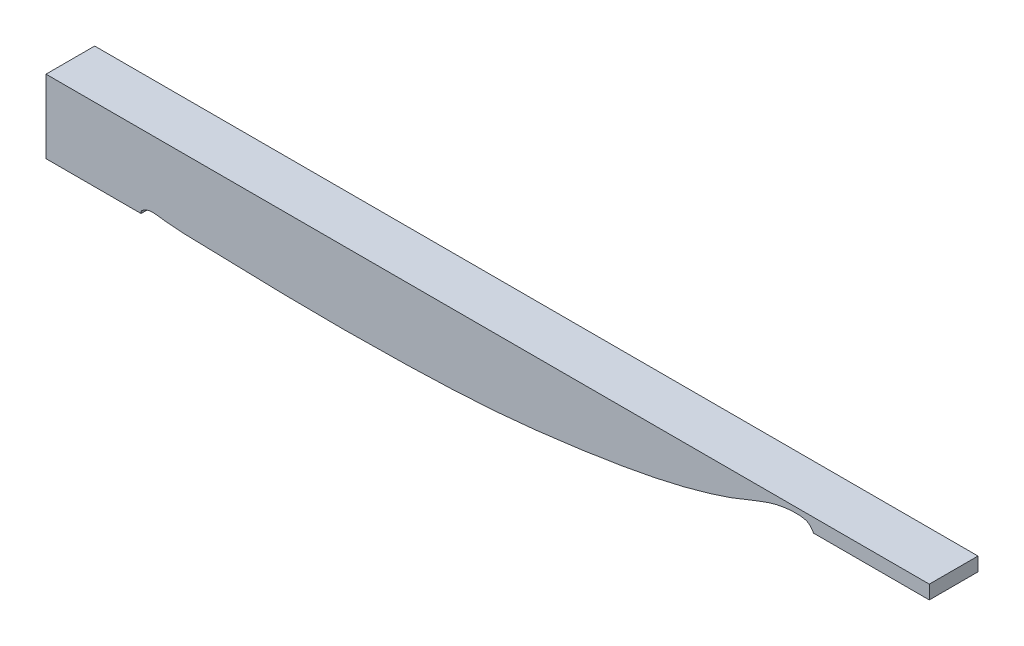
ISO-10303-21;
HEADER;
FILE_DESCRIPTION(('STEP AP214'),'2;1');
FILE_NAME('part.step','',(''),(''),'','','');
FILE_SCHEMA(('AUTOMOTIVE_DESIGN { 1 0 10303 214 1 1 1 1 }'));
ENDSEC;
DATA;
#1=APPLICATION_CONTEXT('core data for automotive mechanical design processes');
#2=APPLICATION_PROTOCOL_DEFINITION('international standard','automotive_design',2000,#1);
#3=PRODUCT_CONTEXT('',#1,'mechanical');
#4=PRODUCT('Part','Part','',(#3));
#5=PRODUCT_RELATED_PRODUCT_CATEGORY('part','',(#4));
#6=PRODUCT_DEFINITION_FORMATION('','',#4);
#7=PRODUCT_DEFINITION_CONTEXT('part definition',#1,'design');
#8=PRODUCT_DEFINITION('design','',#6,#7);
#9=PRODUCT_DEFINITION_SHAPE('','',#8);
#10=(LENGTH_UNIT() NAMED_UNIT(*) SI_UNIT(.MILLI.,.METRE.));
#11=(NAMED_UNIT(*) PLANE_ANGLE_UNIT() SI_UNIT($,.RADIAN.));
#12=(NAMED_UNIT(*) SI_UNIT($,.STERADIAN.) SOLID_ANGLE_UNIT());
#13=UNCERTAINTY_MEASURE_WITH_UNIT(LENGTH_MEASURE(1.E-05),#10,'distance_accuracy_value','');
#14=(GEOMETRIC_REPRESENTATION_CONTEXT(3) GLOBAL_UNCERTAINTY_ASSIGNED_CONTEXT((#13)) GLOBAL_UNIT_ASSIGNED_CONTEXT((#10,
#11,#12)) REPRESENTATION_CONTEXT('',''));
#15=CARTESIAN_POINT('',(0.,0.,0.));
#16=DIRECTION('',(0.,0.,1.));
#17=DIRECTION('',(1.,0.,0.));
#18=AXIS2_PLACEMENT_3D('',#15,#16,#17);
#19=CARTESIAN_POINT('',(-66.3110095027111,-9.77705874573914,468.));
#20=CARTESIAN_POINT('',(-66.316235060897,-9.70373392122121,468.));
#21=CARTESIAN_POINT('',(-66.320590620901,-9.63037802621979,468.));
#22=CARTESIAN_POINT('',(-66.2994351576771,-9.48259960274422,468.));
#23=CARTESIAN_POINT('',(-66.2737412349066,-9.41110036570704,468.));
#24=CARTESIAN_POINT('',(-66.1938541980312,-9.28648881474915,468.));
#25=CARTESIAN_POINT('',(-66.137546237911,-9.23559779741836,468.));
#26=CARTESIAN_POINT('',(-66.015569610567,-9.15124688152581,468.));
#27=CARTESIAN_POINT('',(-65.9515979105995,-9.11329273950191,468.));
#28=CARTESIAN_POINT('',(-65.7616357941962,-8.99725054402569,468.));
#29=CARTESIAN_POINT('',(-65.6322068467814,-8.9255063295734,468.));
#30=CARTESIAN_POINT('',(-65.36364446324,-8.80157370983703,468.));
#31=CARTESIAN_POINT('',(-65.2218015380496,-8.75117333694517,468.));
#32=CARTESIAN_POINT('',(-64.7920811657736,-8.65055987463684,468.));
#33=CARTESIAN_POINT('',(-64.498748426524,-8.64014984402587,468.));
#34=CARTESIAN_POINT('',(-63.9084686470068,-8.66185594778682,468.));
#35=CARTESIAN_POINT('',(-63.6156463601992,-8.69305676855666,468.));
#36=CARTESIAN_POINT('',(-63.0315131567371,-8.76872772810805,468.));
#37=CARTESIAN_POINT('',(-62.7402803659261,-8.81388378533273,468.));
#38=CARTESIAN_POINT('',(-62.1563596897273,-8.89142066226824,468.));
#39=CARTESIAN_POINT('',(-61.8641544527243,-8.92565694711292,468.));
#40=CARTESIAN_POINT('',(-60.9868927624616,-9.01350842805019,468.));
#41=CARTESIAN_POINT('',(-60.401091968761,-9.05154446464127,468.));
#42=CARTESIAN_POINT('',(-59.228566214093,-9.10784441739108,468.));
#43=CARTESIAN_POINT('',(-58.6418581508111,-9.12646985151838,468.));
#44=CARTESIAN_POINT('',(-57.4684400228828,-9.16367790152774,468.));
#45=CARTESIAN_POINT('',(-56.881759724461,-9.18289735167031,468.));
#46=CARTESIAN_POINT('',(-55.1215548174675,-9.23704674895261,468.));
#47=CARTESIAN_POINT('',(-53.9478735679473,-9.2687248263806,468.));
#48=CARTESIAN_POINT('',(-50.4268414826073,-9.36336201099867,468.));
#49=CARTESIAN_POINT('',(-48.0793775997674,-9.42254574649968,468.));
#50=CARTESIAN_POINT('',(-43.3841243063974,-9.52650283424932,468.));
#51=CARTESIAN_POINT('',(-41.0363103011304,-9.56944344485701,468.));
#52=CARTESIAN_POINT('',(-36.3403438046695,-9.61947289780728,468.));
#53=CARTESIAN_POINT('',(-33.9919627557675,-9.62565823989537,468.));
#54=CARTESIAN_POINT('',(-29.2961037073124,-9.59793964723191,468.));
#55=CARTESIAN_POINT('',(-26.9485383604573,-9.56564052762976,468.));
#56=CARTESIAN_POINT('',(-22.2540396939604,-9.46904010761587,468.));
#57=CARTESIAN_POINT('',(-19.9070828662086,-9.40592912112159,468.));
#58=CARTESIAN_POINT('',(-15.2141141243525,-9.23186221874731,468.));
#59=CARTESIAN_POINT('',(-12.8683166801389,-9.11918688066645,468.));
#60=CARTESIAN_POINT('',(-8.18271802495874,-8.81034149714294,468.));
#61=CARTESIAN_POINT('',(-5.84203261713828,-8.61374313028795,468.));
#62=CARTESIAN_POINT('',(-1.17014603737237,-8.13908916438039,468.));
#63=CARTESIAN_POINT('',(1.16171034527469,-7.86206943345416,468.));
#64=CARTESIAN_POINT('',(5.81808123507902,-7.24929655418815,468.));
#65=CARTESIAN_POINT('',(8.14181543950713,-6.91267273777016,468.));
#66=CARTESIAN_POINT('',(12.7787607681388,-6.16794158398201,468.));
#67=CARTESIAN_POINT('',(15.0916661781894,-5.76240480398166,468.));
#68=CARTESIAN_POINT('',(19.6884194278233,-4.83869043413857,468.));
#69=CARTESIAN_POINT('',(21.9721303995811,-4.31587822244079,468.));
#70=CARTESIAN_POINT('',(25.3685221957537,-3.41040091536672,468.));
#71=CARTESIAN_POINT('',(26.4961269513122,-3.08976433101442,468.));
#72=CARTESIAN_POINT('',(28.7392538966182,-2.3982722515288,468.));
#73=CARTESIAN_POINT('',(29.8556671362242,-2.02682774429234,468.));
#74=CARTESIAN_POINT('',(31.5128618434781,-1.41397354852262,468.));
#75=CARTESIAN_POINT('',(32.0621921110085,-1.20047556068313,468.));
#76=CARTESIAN_POINT('',(33.1574367830389,-0.763221584265976,468.));
#77=CARTESIAN_POINT('',(33.7028908354116,-0.538083136140406,468.));
#78=CARTESIAN_POINT('',(35.3413749173231,0.130959966169594,468.));
#79=CARTESIAN_POINT('',(36.4377962564904,0.56468035466094,468.));
#80=CARTESIAN_POINT('',(38.1441855648698,1.02980080052477,468.));
#81=CARTESIAN_POINT('',(38.723787685197,1.15239096051434,468.));
#82=CARTESIAN_POINT('',(39.6104387070315,1.28448010456115,468.));
#83=CARTESIAN_POINT('',(39.9097057009456,1.32017586681444,468.));
#84=CARTESIAN_POINT('',(40.5072433988631,1.3723344739042,468.));
#85=CARTESIAN_POINT('',(40.8060156179092,1.38864015643561,468.));
#86=CARTESIAN_POINT('',(41.4035675133122,1.39962450670178,468.));
#87=CARTESIAN_POINT('',(41.7023469892687,1.39488435730762,468.));
#88=CARTESIAN_POINT('',(42.1505277224835,1.35436696470905,468.));
#89=CARTESIAN_POINT('',(42.2999231896729,1.3353815528152,468.));
#90=CARTESIAN_POINT('',(42.5987186558118,1.28426813017239,468.));
#91=CARTESIAN_POINT('',(42.7463478538573,1.25189033098443,468.));
#92=CARTESIAN_POINT('',(43.0339939985054,1.16307564060746,468.));
#93=CARTESIAN_POINT('',(43.1762163917963,1.10509680828546,468.));
#94=CARTESIAN_POINT('',(43.4357542907977,0.949851637938548,468.));
#95=CARTESIAN_POINT('',(43.5493550532887,0.85101088110151,468.));
#96=CARTESIAN_POINT('',(43.7573714935788,0.628662042901316,468.));
#97=CARTESIAN_POINT('',(43.8487921954567,0.507471021302604,468.));
#98=CARTESIAN_POINT('',(43.9915059507407,0.330126962019227,468.));
#99=CARTESIAN_POINT('',(44.0393684411632,0.271244030718783,468.));
#100=CARTESIAN_POINT('',(44.12396529561,0.144622886535333,468.));
#101=CARTESIAN_POINT('',(44.1582968168547,0.0760298951479388,468.));
#102=CARTESIAN_POINT('',(44.1704635352954,0.,468.));
#103=B_SPLINE_CURVE_WITH_KNOTS('',3,(#19,#20,#21,#22,#23,#24,#25,#26,#27,#28,#29,#30,#31,#32,
#33,#34,#35,#36,#37,#38,#39,#40,#41,#42,#43,#44,#45,#46,#47,#48,#49,#50,#51,#52,#53,#54,#55,#56,
#57,#58,#59,#60,#61,#62,#63,#64,#65,#66,#67,#68,#69,#70,#71,#72,#73,#74,#75,#76,#77,#78,#79,#80,
#81,#82,#83,#84,#85,#86,#87,#88,#89,#90,#91,#92,#93,#94,#95,#96,#97,#98,#99,#100,#101,#102),
.UNSPECIFIED.,.F.,.F.,(4,2,2,2,2,2,2,2,2,2,2,2,2,2,2,2,2,2,2,2,2,2,2,2,2,2,2,2,2,2,2,2,2,2,2,2,
2,2,2,2,2,4),(0.,0.001953125,0.00390625,0.00585937500000011,0.00781250000000022,
0.0117187500000003,0.0156250000000006,0.0234375000000003,0.0312500000000002,0.0390625000000001,
0.0468750000000002,0.0625000000000002,0.0781250000000003,0.0937500000000004,0.125,0.1875,0.25,
0.312500000000001,0.375000000000001,0.437500000000001,0.500000000000001,0.562500000000001,
0.625000000000001,0.687500000000001,0.750000000000001,0.812500000000001,0.843750000000001,
0.875000000000001,0.890625000000001,0.906250000000001,0.937500000000001,0.953125000000001,
0.960937500000001,0.968750000000001,0.9765625,0.98046875,0.984375,0.98828125,0.9921875,
0.99609375,0.998046875,1.),.UNSPECIFIED.);
#104=DIRECTION('',(0.,0.,-1.));
#105=VECTOR('',#104,1.);
#106=SURFACE_OF_LINEAR_EXTRUSION('',#103,#105);
#107=CARTESIAN_POINT('',(-66.3110095027111,-9.77705874573914,460.));
#108=CARTESIAN_POINT('',(-66.316235060897,-9.70373392122121,460.));
#109=CARTESIAN_POINT('',(-66.320590620901,-9.63037802621979,460.));
#110=CARTESIAN_POINT('',(-66.2994351576771,-9.48259960274422,460.));
#111=CARTESIAN_POINT('',(-66.2737412349066,-9.41110036570704,460.));
#112=CARTESIAN_POINT('',(-66.1938541980312,-9.28648881474915,460.));
#113=CARTESIAN_POINT('',(-66.137546237911,-9.23559779741836,460.));
#114=CARTESIAN_POINT('',(-66.015569610567,-9.15124688152581,460.));
#115=CARTESIAN_POINT('',(-65.9515979105995,-9.11329273950191,460.));
#116=CARTESIAN_POINT('',(-65.7616357941962,-8.99725054402569,460.));
#117=CARTESIAN_POINT('',(-65.6322068467814,-8.9255063295734,460.));
#118=CARTESIAN_POINT('',(-65.36364446324,-8.80157370983703,460.));
#119=CARTESIAN_POINT('',(-65.2218015380496,-8.75117333694517,460.));
#120=CARTESIAN_POINT('',(-64.7920811657736,-8.65055987463684,460.));
#121=CARTESIAN_POINT('',(-64.498748426524,-8.64014984402587,460.));
#122=CARTESIAN_POINT('',(-63.9084686470068,-8.66185594778682,460.));
#123=CARTESIAN_POINT('',(-63.6156463601992,-8.69305676855666,460.));
#124=CARTESIAN_POINT('',(-63.0315131567371,-8.76872772810805,460.));
#125=CARTESIAN_POINT('',(-62.7402803659261,-8.81388378533273,460.));
#126=CARTESIAN_POINT('',(-62.1563596897273,-8.89142066226824,460.));
#127=CARTESIAN_POINT('',(-61.8641544527243,-8.92565694711292,460.));
#128=CARTESIAN_POINT('',(-60.9868927624616,-9.01350842805019,460.));
#129=CARTESIAN_POINT('',(-60.401091968761,-9.05154446464127,460.));
#130=CARTESIAN_POINT('',(-59.228566214093,-9.10784441739108,460.));
#131=CARTESIAN_POINT('',(-58.6418581508111,-9.12646985151838,460.));
#132=CARTESIAN_POINT('',(-57.4684400228828,-9.16367790152774,460.));
#133=CARTESIAN_POINT('',(-56.881759724461,-9.18289735167031,460.));
#134=CARTESIAN_POINT('',(-55.1215548174675,-9.23704674895261,460.));
#135=CARTESIAN_POINT('',(-53.9478735679473,-9.2687248263806,460.));
#136=CARTESIAN_POINT('',(-50.4268414826073,-9.36336201099867,460.));
#137=CARTESIAN_POINT('',(-48.0793775997674,-9.42254574649968,460.));
#138=CARTESIAN_POINT('',(-43.3841243063974,-9.52650283424932,460.));
#139=CARTESIAN_POINT('',(-41.0363103011304,-9.56944344485701,460.));
#140=CARTESIAN_POINT('',(-36.3403438046695,-9.61947289780728,460.));
#141=CARTESIAN_POINT('',(-33.9919627557675,-9.62565823989537,460.));
#142=CARTESIAN_POINT('',(-29.2961037073124,-9.59793964723191,460.));
#143=CARTESIAN_POINT('',(-26.9485383604573,-9.56564052762976,460.));
#144=CARTESIAN_POINT('',(-22.2540396939604,-9.46904010761587,460.));
#145=CARTESIAN_POINT('',(-19.9070828662086,-9.40592912112159,460.));
#146=CARTESIAN_POINT('',(-15.2141141243525,-9.23186221874731,460.));
#147=CARTESIAN_POINT('',(-12.8683166801389,-9.11918688066645,460.));
#148=CARTESIAN_POINT('',(-8.18271802495874,-8.81034149714294,460.));
#149=CARTESIAN_POINT('',(-5.84203261713828,-8.61374313028795,460.));
#150=CARTESIAN_POINT('',(-1.17014603737237,-8.13908916438039,460.));
#151=CARTESIAN_POINT('',(1.16171034527469,-7.86206943345416,460.));
#152=CARTESIAN_POINT('',(5.81808123507902,-7.24929655418815,460.));
#153=CARTESIAN_POINT('',(8.14181543950713,-6.91267273777016,460.));
#154=CARTESIAN_POINT('',(12.7787607681388,-6.16794158398201,460.));
#155=CARTESIAN_POINT('',(15.0916661781894,-5.76240480398166,460.));
#156=CARTESIAN_POINT('',(19.6884194278233,-4.83869043413857,460.));
#157=CARTESIAN_POINT('',(21.9721303995811,-4.31587822244079,460.));
#158=CARTESIAN_POINT('',(25.3685221957537,-3.41040091536672,460.));
#159=CARTESIAN_POINT('',(26.4961269513122,-3.08976433101442,460.));
#160=CARTESIAN_POINT('',(28.7392538966182,-2.3982722515288,460.));
#161=CARTESIAN_POINT('',(29.8556671362242,-2.02682774429234,460.));
#162=CARTESIAN_POINT('',(31.5128618434781,-1.41397354852262,460.));
#163=CARTESIAN_POINT('',(32.0621921110085,-1.20047556068313,460.));
#164=CARTESIAN_POINT('',(33.1574367830389,-0.763221584265976,460.));
#165=CARTESIAN_POINT('',(33.7028908354116,-0.538083136140406,460.));
#166=CARTESIAN_POINT('',(35.3413749173231,0.130959966169594,460.));
#167=CARTESIAN_POINT('',(36.4377962564904,0.56468035466094,460.));
#168=CARTESIAN_POINT('',(38.1441855648698,1.02980080052477,460.));
#169=CARTESIAN_POINT('',(38.723787685197,1.15239096051434,460.));
#170=CARTESIAN_POINT('',(39.6104387070315,1.28448010456115,460.));
#171=CARTESIAN_POINT('',(39.9097057009456,1.32017586681444,460.));
#172=CARTESIAN_POINT('',(40.5072433988631,1.3723344739042,460.));
#173=CARTESIAN_POINT('',(40.8060156179092,1.38864015643561,460.));
#174=CARTESIAN_POINT('',(41.4035675133122,1.39962450670178,460.));
#175=CARTESIAN_POINT('',(41.7023469892687,1.39488435730762,460.));
#176=CARTESIAN_POINT('',(42.1505277224835,1.35436696470905,460.));
#177=CARTESIAN_POINT('',(42.2999231896729,1.3353815528152,460.));
#178=CARTESIAN_POINT('',(42.5987186558118,1.28426813017239,460.));
#179=CARTESIAN_POINT('',(42.7463478538573,1.25189033098443,460.));
#180=CARTESIAN_POINT('',(43.0339939985054,1.16307564060746,460.));
#181=CARTESIAN_POINT('',(43.1762163917963,1.10509680828546,460.));
#182=CARTESIAN_POINT('',(43.4357542907977,0.949851637938548,460.));
#183=CARTESIAN_POINT('',(43.5493550532887,0.85101088110151,460.));
#184=CARTESIAN_POINT('',(43.7573714935788,0.628662042901316,460.));
#185=CARTESIAN_POINT('',(43.8487921954567,0.507471021302604,460.));
#186=CARTESIAN_POINT('',(43.9915059507407,0.330126962019227,460.));
#187=CARTESIAN_POINT('',(44.0393684411632,0.271244030718783,460.));
#188=CARTESIAN_POINT('',(44.12396529561,0.144622886535333,460.));
#189=CARTESIAN_POINT('',(44.1582968168547,0.0760298951479388,460.));
#190=CARTESIAN_POINT('',(44.1704635352954,0.,460.));
#191=B_SPLINE_CURVE_WITH_KNOTS('',3,(#107,#108,#109,#110,#111,#112,#113,#114,#115,#116,#117,
#118,#119,#120,#121,#122,#123,#124,#125,#126,#127,#128,#129,#130,#131,#132,#133,#134,#135,#136,
#137,#138,#139,#140,#141,#142,#143,#144,#145,#146,#147,#148,#149,#150,#151,#152,#153,#154,#155,
#156,#157,#158,#159,#160,#161,#162,#163,#164,#165,#166,#167,#168,#169,#170,#171,#172,#173,#174,
#175,#176,#177,#178,#179,#180,#181,#182,#183,#184,#185,#186,#187,#188,#189,#190),.UNSPECIFIED.,
.F.,.F.,(4,2,2,2,2,2,2,2,2,2,2,2,2,2,2,2,2,2,2,2,2,2,2,2,2,2,2,2,2,2,2,2,2,2,2,2,2,2,2,2,2,4),
(0.,0.001953125,0.00390625,0.00585937500000011,0.00781250000000022,0.0117187500000003,
0.0156250000000006,0.0234375000000003,0.0312500000000002,0.0390625000000001,0.0468750000000002,
0.0625000000000002,0.0781250000000003,0.0937500000000004,0.125,0.1875,0.25,0.312500000000001,
0.375000000000001,0.437500000000001,0.500000000000001,0.562500000000001,0.625000000000001,
0.687500000000001,0.750000000000001,0.812500000000001,0.843750000000001,0.875000000000001,
0.890625000000001,0.906250000000001,0.937500000000001,0.953125000000001,0.960937500000001,
0.968750000000001,0.9765625,0.98046875,0.984375,0.98828125,0.9921875,0.99609375,0.998046875,1.),.UNSPECIFIED.);
#192=CARTESIAN_POINT('',(-66.3110095027111,-9.77705874573913,460.));
#193=VERTEX_POINT('',#192);
#194=CARTESIAN_POINT('',(44.1704635352954,-1.0147624114696E-13,460.));
#195=VERTEX_POINT('',#194);
#196=EDGE_CURVE('E165',#193,#195,#191,.T.);
#197=ORIENTED_EDGE('',*,*,#196,.T.);
#198=DIRECTION('',(0.,0.,-1.));
#199=VECTOR('',#198,1.);
#200=CARTESIAN_POINT('',(44.1704635352954,-1.0147624114696E-13,468.));
#201=LINE('',#200,#199);
#202=CARTESIAN_POINT('',(44.1704635352954,-1.0147624114696E-13,468.));
#203=VERTEX_POINT('',#202);
#204=EDGE_CURVE('E11',#203,#195,#201,.T.);
#205=ORIENTED_EDGE('',*,*,#204,.F.);
#206=CARTESIAN_POINT('',(44.1704635352954,0.,468.));
#207=CARTESIAN_POINT('',(44.1582968168547,0.0760298951479388,468.));
#208=CARTESIAN_POINT('',(44.12396529561,0.144622886535333,468.));
#209=CARTESIAN_POINT('',(44.0393684411632,0.271244030718783,468.));
#210=CARTESIAN_POINT('',(43.9915059507407,0.330126962019227,468.));
#211=CARTESIAN_POINT('',(43.8487921954567,0.507471021302604,468.));
#212=CARTESIAN_POINT('',(43.7573714935788,0.628662042901316,468.));
#213=CARTESIAN_POINT('',(43.5493550532887,0.85101088110151,468.));
#214=CARTESIAN_POINT('',(43.4357542907977,0.949851637938548,468.));
#215=CARTESIAN_POINT('',(43.1762163917963,1.10509680828546,468.));
#216=CARTESIAN_POINT('',(43.0339939985054,1.16307564060746,468.));
#217=CARTESIAN_POINT('',(42.7463478538573,1.25189033098443,468.));
#218=CARTESIAN_POINT('',(42.5987186558118,1.28426813017239,468.));
#219=CARTESIAN_POINT('',(42.2999231896729,1.3353815528152,468.));
#220=CARTESIAN_POINT('',(42.1505277224835,1.35436696470905,468.));
#221=CARTESIAN_POINT('',(41.7023469892687,1.39488435730762,468.));
#222=CARTESIAN_POINT('',(41.4035675133122,1.39962450670178,468.));
#223=CARTESIAN_POINT('',(40.8060156179092,1.38864015643561,468.));
#224=CARTESIAN_POINT('',(40.5072433988631,1.3723344739042,468.));
#225=CARTESIAN_POINT('',(39.9097057009456,1.32017586681444,468.));
#226=CARTESIAN_POINT('',(39.6104387070315,1.28448010456115,468.));
#227=CARTESIAN_POINT('',(38.723787685197,1.15239096051434,468.));
#228=CARTESIAN_POINT('',(38.1441855648698,1.02980080052477,468.));
#229=CARTESIAN_POINT('',(36.4377962564904,0.56468035466094,468.));
#230=CARTESIAN_POINT('',(35.3413749173231,0.130959966169594,468.));
#231=CARTESIAN_POINT('',(33.7028908354116,-0.538083136140406,468.));
#232=CARTESIAN_POINT('',(33.1574367830389,-0.763221584265976,468.));
#233=CARTESIAN_POINT('',(32.0621921110085,-1.20047556068313,468.));
#234=CARTESIAN_POINT('',(31.5128618434781,-1.41397354852262,468.));
#235=CARTESIAN_POINT('',(29.8556671362242,-2.02682774429234,468.));
#236=CARTESIAN_POINT('',(28.7392538966182,-2.3982722515288,468.));
#237=CARTESIAN_POINT('',(26.4961269513122,-3.08976433101442,468.));
#238=CARTESIAN_POINT('',(25.3685221957537,-3.41040091536672,468.));
#239=CARTESIAN_POINT('',(21.9721303995811,-4.31587822244079,468.));
#240=CARTESIAN_POINT('',(19.6884194278233,-4.83869043413857,468.));
#241=CARTESIAN_POINT('',(15.0916661781894,-5.76240480398166,468.));
#242=CARTESIAN_POINT('',(12.7787607681388,-6.16794158398201,468.));
#243=CARTESIAN_POINT('',(8.14181543950713,-6.91267273777016,468.));
#244=CARTESIAN_POINT('',(5.81808123507902,-7.24929655418815,468.));
#245=CARTESIAN_POINT('',(1.16171034527469,-7.86206943345416,468.));
#246=CARTESIAN_POINT('',(-1.17014603737237,-8.13908916438039,468.));
#247=CARTESIAN_POINT('',(-5.84203261713828,-8.61374313028795,468.));
#248=CARTESIAN_POINT('',(-8.18271802495874,-8.81034149714294,468.));
#249=CARTESIAN_POINT('',(-12.8683166801389,-9.11918688066645,468.));
#250=CARTESIAN_POINT('',(-15.2141141243525,-9.23186221874731,468.));
#251=CARTESIAN_POINT('',(-19.9070828662086,-9.40592912112159,468.));
#252=CARTESIAN_POINT('',(-22.2540396939604,-9.46904010761587,468.));
#253=CARTESIAN_POINT('',(-26.9485383604573,-9.56564052762976,468.));
#254=CARTESIAN_POINT('',(-29.2961037073124,-9.59793964723191,468.));
#255=CARTESIAN_POINT('',(-33.9919627557675,-9.62565823989537,468.));
#256=CARTESIAN_POINT('',(-36.3403438046695,-9.61947289780728,468.));
#257=CARTESIAN_POINT('',(-41.0363103011304,-9.56944344485701,468.));
#258=CARTESIAN_POINT('',(-43.3841243063974,-9.52650283424932,468.));
#259=CARTESIAN_POINT('',(-48.0793775997674,-9.42254574649968,468.));
#260=CARTESIAN_POINT('',(-50.4268414826073,-9.36336201099867,468.));
#261=CARTESIAN_POINT('',(-53.9478735679473,-9.2687248263806,468.));
#262=CARTESIAN_POINT('',(-55.1215548174675,-9.23704674895261,468.));
#263=CARTESIAN_POINT('',(-56.881759724461,-9.18289735167031,468.));
#264=CARTESIAN_POINT('',(-57.4684400228828,-9.16367790152774,468.));
#265=CARTESIAN_POINT('',(-58.6418581508111,-9.12646985151838,468.));
#266=CARTESIAN_POINT('',(-59.228566214093,-9.10784441739108,468.));
#267=CARTESIAN_POINT('',(-60.401091968761,-9.05154446464127,468.));
#268=CARTESIAN_POINT('',(-60.9868927624616,-9.01350842805019,468.));
#269=CARTESIAN_POINT('',(-61.8641544527243,-8.92565694711292,468.));
#270=CARTESIAN_POINT('',(-62.1563596897273,-8.89142066226824,468.));
#271=CARTESIAN_POINT('',(-62.7402803659261,-8.81388378533273,468.));
#272=CARTESIAN_POINT('',(-63.0315131567371,-8.76872772810805,468.));
#273=CARTESIAN_POINT('',(-63.6156463601992,-8.69305676855666,468.));
#274=CARTESIAN_POINT('',(-63.9084686470068,-8.66185594778682,468.));
#275=CARTESIAN_POINT('',(-64.498748426524,-8.64014984402587,468.));
#276=CARTESIAN_POINT('',(-64.7920811657736,-8.65055987463684,468.));
#277=CARTESIAN_POINT('',(-65.2218015380496,-8.75117333694517,468.));
#278=CARTESIAN_POINT('',(-65.36364446324,-8.80157370983703,468.));
#279=CARTESIAN_POINT('',(-65.6322068467814,-8.9255063295734,468.));
#280=CARTESIAN_POINT('',(-65.7616357941962,-8.99725054402569,468.));
#281=CARTESIAN_POINT('',(-65.9515979105995,-9.11329273950191,468.));
#282=CARTESIAN_POINT('',(-66.015569610567,-9.15124688152581,468.));
#283=CARTESIAN_POINT('',(-66.137546237911,-9.23559779741836,468.));
#284=CARTESIAN_POINT('',(-66.1938541980312,-9.28648881474915,468.));
#285=CARTESIAN_POINT('',(-66.2737412349066,-9.41110036570704,468.));
#286=CARTESIAN_POINT('',(-66.2994351576771,-9.48259960274422,468.));
#287=CARTESIAN_POINT('',(-66.320590620901,-9.63037802621979,468.));
#288=CARTESIAN_POINT('',(-66.316235060897,-9.70373392122121,468.));
#289=CARTESIAN_POINT('',(-66.3110095027111,-9.77705874573914,468.));
#290=B_SPLINE_CURVE_WITH_KNOTS('',3,(#206,#207,#208,#209,#210,#211,#212,#213,#214,#215,#216,
#217,#218,#219,#220,#221,#222,#223,#224,#225,#226,#227,#228,#229,#230,#231,#232,#233,#234,#235,
#236,#237,#238,#239,#240,#241,#242,#243,#244,#245,#246,#247,#248,#249,#250,#251,#252,#253,#254,
#255,#256,#257,#258,#259,#260,#261,#262,#263,#264,#265,#266,#267,#268,#269,#270,#271,#272,#273,
#274,#275,#276,#277,#278,#279,#280,#281,#282,#283,#284,#285,#286,#287,#288,#289),.UNSPECIFIED.,
.F.,.F.,(4,2,2,2,2,2,2,2,2,2,2,2,2,2,2,2,2,2,2,2,2,2,2,2,2,2,2,2,2,2,2,2,2,2,2,2,2,2,2,2,2,4),
(0.,0.001953125,0.00390624999999989,0.00781249999999989,0.0117187499999998,0.0156249999999998,
0.0195312499999997,0.0234374999999996,0.0312499999999994,0.0390624999999993,0.0468749999999992,
0.0624999999999991,0.0937499999999989,0.109374999999999,0.124999999999999,0.156249999999999,
0.187499999999999,0.249999999999999,0.312499999999999,0.374999999999999,0.437499999999999,
0.499999999999999,0.562499999999999,0.624999999999999,0.687499999999999,0.75,0.8125,0.875,
0.90625,0.921875,0.9375,0.953125,0.9609375,0.96875,0.9765625,0.984374999999999,0.98828125,
0.9921875,0.994140625,0.99609375,0.998046875,1.),.UNSPECIFIED.);
#291=CARTESIAN_POINT('',(-66.3110095027111,-9.77705874573913,468.));
#292=VERTEX_POINT('',#291);
#293=EDGE_CURVE('E129',#292,#203,#290,.F.);
#294=ORIENTED_EDGE('',*,*,#293,.F.);
#295=DIRECTION('',(0.,0.,-1.));
#296=VECTOR('',#295,1.);
#297=CARTESIAN_POINT('',(-66.3110095027111,-9.77705874573913,468.));
#298=LINE('',#297,#296);
#299=EDGE_CURVE('E114',#292,#193,#298,.T.);
#300=ORIENTED_EDGE('',*,*,#299,.T.);
#301=EDGE_LOOP('',(#197,#205,#294,#300));
#302=FACE_BOUND('',#301,.T.);
#303=ADVANCED_FACE('F30',(#302),#106,.F.);
#304=CARTESIAN_POINT('',(44.1704635352954,-1.0147624114696E-13,468.));
#305=DIRECTION('',(0.,1.,0.));
#306=DIRECTION('',(-1.,0.,0.));
#307=AXIS2_PLACEMENT_3D('',#304,#305,#306);
#308=PLANE('',#307);
#309=DIRECTION('',(1.,0.,0.));
#310=VECTOR('',#309,1.);
#311=CARTESIAN_POINT('',(44.1704635352954,-1.0147624114696E-13,460.));
#312=LINE('',#311,#310);
#313=CARTESIAN_POINT('',(63.2165123294192,0.,460.));
#314=VERTEX_POINT('',#313);
#315=EDGE_CURVE('E120',#195,#314,#312,.T.);
#316=ORIENTED_EDGE('',*,*,#315,.T.);
#317=DIRECTION('',(0.,0.,-1.));
#318=VECTOR('',#317,1.);
#319=CARTESIAN_POINT('',(63.2165123294192,0.,468.));
#320=LINE('',#319,#318);
#321=CARTESIAN_POINT('',(63.2165123294192,0.,468.));
#322=VERTEX_POINT('',#321);
#323=EDGE_CURVE('E41',#322,#314,#320,.T.);
#324=ORIENTED_EDGE('',*,*,#323,.F.);
#325=DIRECTION('',(1.,0.,0.));
#326=VECTOR('',#325,1.);
#327=CARTESIAN_POINT('',(44.1704635352954,-1.0147624114696E-13,468.));
#328=LINE('',#327,#326);
#329=EDGE_CURVE('E87',#203,#322,#328,.T.);
#330=ORIENTED_EDGE('',*,*,#329,.F.);
#331=ORIENTED_EDGE('',*,*,#204,.T.);
#332=EDGE_LOOP('',(#316,#324,#330,#331));
#333=FACE_BOUND('',#332,.T.);
#334=ADVANCED_FACE('F199',(#333),#308,.F.);
#335=CARTESIAN_POINT('',(63.2165123294192,2.25600000000005,468.));
#336=DIRECTION('',(-1.,0.,0.));
#337=DIRECTION('',(0.,0.,1.));
#338=AXIS2_PLACEMENT_3D('',#335,#336,#337);
#339=PLANE('',#338);
#340=DIRECTION('',(0.,1.,0.));
#341=VECTOR('',#340,1.);
#342=CARTESIAN_POINT('',(63.2165123294192,2.25600000000005,460.));
#343=LINE('',#342,#341);
#344=CARTESIAN_POINT('',(63.2165123294192,2.25600000000005,460.));
#345=VERTEX_POINT('',#344);
#346=EDGE_CURVE('E118',#314,#345,#343,.T.);
#347=ORIENTED_EDGE('',*,*,#346,.T.);
#348=DIRECTION('',(0.,0.,-1.));
#349=VECTOR('',#348,1.);
#350=CARTESIAN_POINT('',(63.2165123294192,2.25600000000005,468.));
#351=LINE('',#350,#349);
#352=CARTESIAN_POINT('',(63.2165123294192,2.25600000000005,468.));
#353=VERTEX_POINT('',#352);
#354=EDGE_CURVE('E109',#353,#345,#351,.T.);
#355=ORIENTED_EDGE('',*,*,#354,.F.);
#356=DIRECTION('',(0.,1.,0.));
#357=VECTOR('',#356,1.);
#358=CARTESIAN_POINT('',(63.2165123294192,2.25600000000005,468.));
#359=LINE('',#358,#357);
#360=EDGE_CURVE('E100',#322,#353,#359,.T.);
#361=ORIENTED_EDGE('',*,*,#360,.F.);
#362=ORIENTED_EDGE('',*,*,#323,.T.);
#363=EDGE_LOOP('',(#347,#355,#361,#362));
#364=FACE_BOUND('',#363,.T.);
#365=ADVANCED_FACE('F202',(#364),#339,.F.);
#366=CARTESIAN_POINT('',(63.2165123294192,2.25600000000005,468.));
#367=DIRECTION('',(0.,-1.,0.));
#368=DIRECTION('',(1.,0.,0.));
#369=AXIS2_PLACEMENT_3D('',#366,#367,#368);
#370=PLANE('',#369);
#371=DIRECTION('',(-1.,0.,0.));
#372=VECTOR('',#371,1.);
#373=CARTESIAN_POINT('',(63.2165123294192,2.25600000000005,460.));
#374=LINE('',#373,#372);
#375=CARTESIAN_POINT('',(-81.9321367240462,2.25600000000003,460.));
#376=VERTEX_POINT('',#375);
#377=EDGE_CURVE('E108',#345,#376,#374,.T.);
#378=ORIENTED_EDGE('',*,*,#377,.T.);
#379=DIRECTION('',(0.,0.,-1.));
#380=VECTOR('',#379,1.);
#381=CARTESIAN_POINT('',(-81.9321367240462,2.25600000000003,468.));
#382=LINE('',#381,#380);
#383=CARTESIAN_POINT('',(-81.9321367240462,2.25600000000003,468.));
#384=VERTEX_POINT('',#383);
#385=EDGE_CURVE('E105',#384,#376,#382,.T.);
#386=ORIENTED_EDGE('',*,*,#385,.F.);
#387=DIRECTION('',(-1.,0.,0.));
#388=VECTOR('',#387,1.);
#389=CARTESIAN_POINT('',(63.2165123294192,2.25600000000005,468.));
#390=LINE('',#389,#388);
#391=EDGE_CURVE('E94',#353,#384,#390,.T.);
#392=ORIENTED_EDGE('',*,*,#391,.F.);
#393=ORIENTED_EDGE('',*,*,#354,.T.);
#394=EDGE_LOOP('',(#378,#386,#392,#393));
#395=FACE_BOUND('',#394,.T.);
#396=ADVANCED_FACE('F106',(#395),#370,.F.);
#397=CARTESIAN_POINT('',(-81.9321367240462,-9.77706554282152,468.));
#398=DIRECTION('',(1.,0.,0.));
#399=DIRECTION('',(0.,1.,0.));
#400=AXIS2_PLACEMENT_3D('',#397,#398,#399);
#401=PLANE('',#400);
#402=DIRECTION('',(0.,-1.,0.));
#403=VECTOR('',#402,1.);
#404=CARTESIAN_POINT('',(-81.9321367240462,-9.77706554282152,460.));
#405=LINE('',#404,#403);
#406=CARTESIAN_POINT('',(-81.9321367240462,-9.77706554282152,460.));
#407=VERTEX_POINT('',#406);
#408=EDGE_CURVE('E73',#376,#407,#405,.T.);
#409=ORIENTED_EDGE('',*,*,#408,.T.);
#410=DIRECTION('',(0.,0.,-1.));
#411=VECTOR('',#410,1.);
#412=CARTESIAN_POINT('',(-81.9321367240462,-9.77706554282152,468.));
#413=LINE('',#412,#411);
#414=CARTESIAN_POINT('',(-81.9321367240462,-9.77706554282152,468.));
#415=VERTEX_POINT('',#414);
#416=EDGE_CURVE('E110',#415,#407,#413,.T.);
#417=ORIENTED_EDGE('',*,*,#416,.F.);
#418=DIRECTION('',(0.,-1.,0.));
#419=VECTOR('',#418,1.);
#420=CARTESIAN_POINT('',(-81.9321367240462,-9.77706554282152,468.));
#421=LINE('',#420,#419);
#422=EDGE_CURVE('E98',#384,#415,#421,.T.);
#423=ORIENTED_EDGE('',*,*,#422,.F.);
#424=ORIENTED_EDGE('',*,*,#385,.T.);
#425=EDGE_LOOP('',(#409,#417,#423,#424));
#426=FACE_BOUND('',#425,.T.);
#427=ADVANCED_FACE('F112',(#426),#401,.F.);
#428=CARTESIAN_POINT('',(-81.9321367240462,-9.77706554282152,468.));
#429=DIRECTION('',(-4.35121120915854E-07,0.999999999999905,0.));
#430=DIRECTION('',(-0.999999999999905,-4.35121120915854E-07,0.));
#431=AXIS2_PLACEMENT_3D('',#428,#429,#430);
#432=PLANE('',#431);
#433=DIRECTION('',(0.999999999999905,4.35121120915853E-07,0.));
#434=VECTOR('',#433,1.);
#435=CARTESIAN_POINT('',(-81.9321367240462,-9.77706554282152,460.));
#436=LINE('',#435,#434);
#437=EDGE_CURVE('E79',#407,#193,#436,.T.);
#438=ORIENTED_EDGE('',*,*,#437,.T.);
#439=ORIENTED_EDGE('',*,*,#299,.F.);
#440=DIRECTION('',(0.999999999999905,4.35121120915853E-07,0.));
#441=VECTOR('',#440,1.);
#442=CARTESIAN_POINT('',(-81.9321367240462,-9.77706554282152,468.));
#443=LINE('',#442,#441);
#444=EDGE_CURVE('E50',#415,#292,#443,.T.);
#445=ORIENTED_EDGE('',*,*,#444,.F.);
#446=ORIENTED_EDGE('',*,*,#416,.T.);
#447=EDGE_LOOP('',(#438,#439,#445,#446));
#448=FACE_BOUND('',#447,.T.);
#449=ADVANCED_FACE('F145',(#448),#432,.F.);
#450=CARTESIAN_POINT('',(-10.5255173525489,-8.9647641889047,468.));
#451=DIRECTION('',(0.,0.,-1.));
#452=DIRECTION('',(-1.,0.,0.));
#453=AXIS2_PLACEMENT_3D('',#450,#451,#452);
#454=PLANE('',#453);
#455=ORIENTED_EDGE('',*,*,#293,.T.);
#456=ORIENTED_EDGE('',*,*,#329,.T.);
#457=ORIENTED_EDGE('',*,*,#360,.T.);
#458=ORIENTED_EDGE('',*,*,#391,.T.);
#459=ORIENTED_EDGE('',*,*,#422,.T.);
#460=ORIENTED_EDGE('',*,*,#444,.T.);
#461=EDGE_LOOP('',(#455,#456,#457,#458,#459,#460));
#462=FACE_BOUND('',#461,.T.);
#463=ADVANCED_FACE('F96',(#462),#454,.F.);
#464=CARTESIAN_POINT('',(-10.5255173525489,-8.9647641889047,460.));
#465=DIRECTION('',(0.,0.,-1.));
#466=DIRECTION('',(-1.,0.,0.));
#467=AXIS2_PLACEMENT_3D('',#464,#465,#466);
#468=PLANE('',#467);
#469=ORIENTED_EDGE('',*,*,#196,.F.);
#470=ORIENTED_EDGE('',*,*,#437,.F.);
#471=ORIENTED_EDGE('',*,*,#408,.F.);
#472=ORIENTED_EDGE('',*,*,#377,.F.);
#473=ORIENTED_EDGE('',*,*,#346,.F.);
#474=ORIENTED_EDGE('',*,*,#315,.F.);
#475=EDGE_LOOP('',(#469,#470,#471,#472,#473,#474));
#476=FACE_BOUND('',#475,.T.);
#477=ADVANCED_FACE('F144',(#476),#468,.T.);
#478=CLOSED_SHELL('',(#303,#334,#365,#396,#427,#449,#463,#477));
#479=MANIFOLD_SOLID_BREP('B2',#478);
#480=ADVANCED_BREP_SHAPE_REPRESENTATION('',(#18,#479),#14);
#481=SHAPE_DEFINITION_REPRESENTATION(#9,#480);
ENDSEC;
END-ISO-10303-21;
